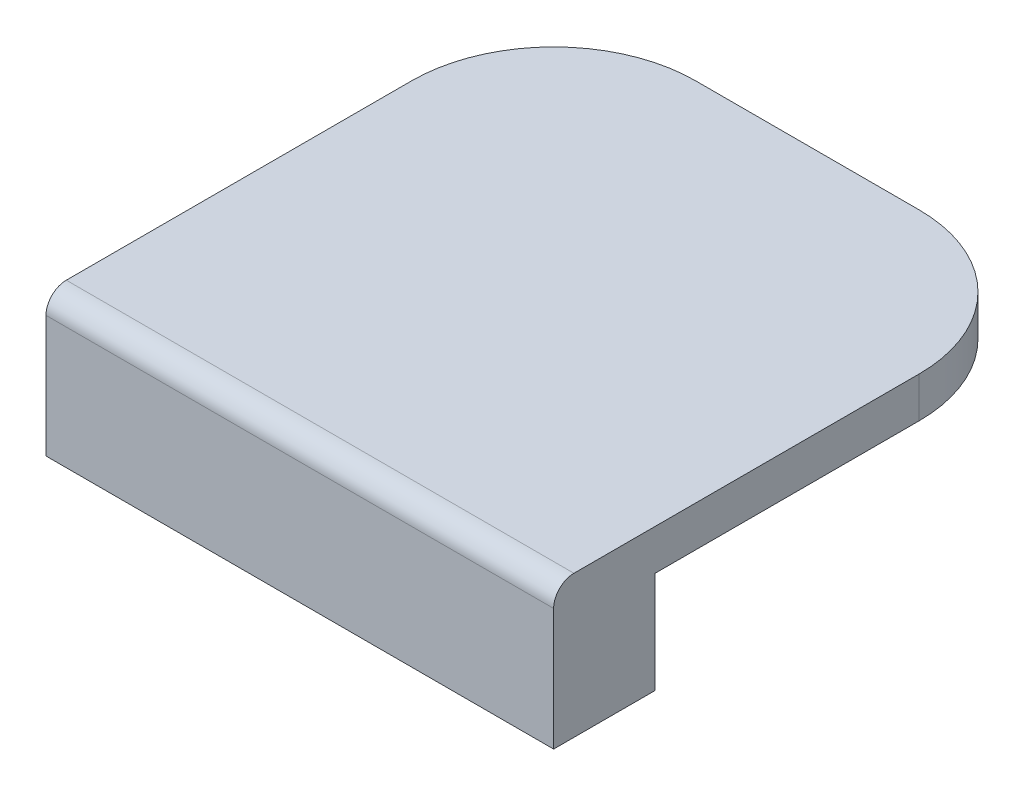
ISO-10303-21;
HEADER;
FILE_DESCRIPTION(('STEP AP214'),'2;1');
FILE_NAME('part.step','',(''),(''),'','','');
FILE_SCHEMA(('AUTOMOTIVE_DESIGN { 1 0 10303 214 1 1 1 1 }'));
ENDSEC;
DATA;
#1=APPLICATION_CONTEXT('core data for automotive mechanical design processes');
#2=APPLICATION_PROTOCOL_DEFINITION('international standard','automotive_design',2000,#1);
#3=PRODUCT_CONTEXT('',#1,'mechanical');
#4=PRODUCT('Part','Part','',(#3));
#5=PRODUCT_RELATED_PRODUCT_CATEGORY('part','',(#4));
#6=PRODUCT_DEFINITION_FORMATION('','',#4);
#7=PRODUCT_DEFINITION_CONTEXT('part definition',#1,'design');
#8=PRODUCT_DEFINITION('design','',#6,#7);
#9=PRODUCT_DEFINITION_SHAPE('','',#8);
#10=(LENGTH_UNIT() NAMED_UNIT(*) SI_UNIT(.MILLI.,.METRE.));
#11=(NAMED_UNIT(*) PLANE_ANGLE_UNIT() SI_UNIT($,.RADIAN.));
#12=(NAMED_UNIT(*) SI_UNIT($,.STERADIAN.) SOLID_ANGLE_UNIT());
#13=UNCERTAINTY_MEASURE_WITH_UNIT(LENGTH_MEASURE(1.E-05),#10,'distance_accuracy_value','');
#14=(GEOMETRIC_REPRESENTATION_CONTEXT(3) GLOBAL_UNCERTAINTY_ASSIGNED_CONTEXT((#13)) GLOBAL_UNIT_ASSIGNED_CONTEXT((#10,
#11,#12)) REPRESENTATION_CONTEXT('',''));
#15=CARTESIAN_POINT('',(0.,0.,0.));
#16=DIRECTION('',(0.,0.,1.));
#17=DIRECTION('',(1.,0.,0.));
#18=AXIS2_PLACEMENT_3D('',#15,#16,#17);
#19=CARTESIAN_POINT('',(-55.,0.,-55.));
#20=DIRECTION('',(0.,1.,0.));
#21=DIRECTION('',(0.,0.,1.));
#22=AXIS2_PLACEMENT_3D('',#19,#20,#21);
#23=PLANE('',#22);
#24=DIRECTION('',(1.,0.,0.));
#25=VECTOR('',#24,1.);
#26=CARTESIAN_POINT('',(-125.,0.,75.));
#27=LINE('',#26,#25);
#28=CARTESIAN_POINT('',(-125.,0.,74.9999999999999));
#29=VERTEX_POINT('',#28);
#30=CARTESIAN_POINT('',(125.,0.,75.));
#31=VERTEX_POINT('',#30);
#32=EDGE_CURVE('E123',#29,#31,#27,.T.);
#33=ORIENTED_EDGE('',*,*,#32,.F.);
#34=DIRECTION('',(0.,0.,1.));
#35=VECTOR('',#34,1.);
#36=CARTESIAN_POINT('',(-125.,0.,-55.));
#37=LINE('',#36,#35);
#38=CARTESIAN_POINT('',(-125.,0.,-55.));
#39=VERTEX_POINT('',#38);
#40=EDGE_CURVE('E129',#39,#29,#37,.T.);
#41=ORIENTED_EDGE('',*,*,#40,.F.);
#42=CARTESIAN_POINT('',(-55.,0.,-55.));
#43=DIRECTION('',(0.,1.,0.));
#44=DIRECTION('',(0.,0.,1.));
#45=AXIS2_PLACEMENT_3D('',#42,#43,#44);
#46=CIRCLE('',#45,70.);
#47=CARTESIAN_POINT('',(-55.,0.,-125.));
#48=VERTEX_POINT('',#47);
#49=EDGE_CURVE('E169',#48,#39,#46,.T.);
#50=ORIENTED_EDGE('',*,*,#49,.F.);
#51=DIRECTION('',(-1.,0.,0.));
#52=VECTOR('',#51,1.);
#53=CARTESIAN_POINT('',(-55.,0.,-125.));
#54=LINE('',#53,#52);
#55=CARTESIAN_POINT('',(55.,0.,-125.));
#56=VERTEX_POINT('',#55);
#57=EDGE_CURVE('E167',#56,#48,#54,.T.);
#58=ORIENTED_EDGE('',*,*,#57,.F.);
#59=CARTESIAN_POINT('',(55.,0.,-55.));
#60=DIRECTION('',(0.,1.,0.));
#61=DIRECTION('',(0.,0.,-1.));
#62=AXIS2_PLACEMENT_3D('',#59,#60,#61);
#63=CIRCLE('',#62,70.);
#64=CARTESIAN_POINT('',(125.,0.,-55.));
#65=VERTEX_POINT('',#64);
#66=EDGE_CURVE('E132',#65,#56,#63,.T.);
#67=ORIENTED_EDGE('',*,*,#66,.F.);
#68=DIRECTION('',(0.,0.,-1.));
#69=VECTOR('',#68,1.);
#70=CARTESIAN_POINT('',(125.,0.,-55.));
#71=LINE('',#70,#69);
#72=EDGE_CURVE('E130',#31,#65,#71,.T.);
#73=ORIENTED_EDGE('',*,*,#72,.F.);
#74=EDGE_LOOP('',(#33,#41,#50,#58,#67,#73));
#75=FACE_BOUND('',#74,.T.);
#76=ADVANCED_FACE('F34',(#75),#23,.F.);
#77=CARTESIAN_POINT('',(125.,20.,-55.));
#78=DIRECTION('',(-1.,0.,0.));
#79=DIRECTION('',(0.,0.,1.));
#80=AXIS2_PLACEMENT_3D('',#77,#78,#79);
#81=PLANE('',#80);
#82=DIRECTION('',(0.,0.,-1.));
#83=VECTOR('',#82,1.);
#84=CARTESIAN_POINT('',(125.,20.,-55.));
#85=LINE('',#84,#83);
#86=CARTESIAN_POINT('',(125.,20.,115.));
#87=VERTEX_POINT('',#86);
#88=CARTESIAN_POINT('',(125.,20.,-55.));
#89=VERTEX_POINT('',#88);
#90=EDGE_CURVE('E190',#87,#89,#85,.T.);
#91=ORIENTED_EDGE('',*,*,#90,.F.);
#92=CARTESIAN_POINT('',(125.,10.,115.));
#93=DIRECTION('',(-1.,0.,0.));
#94=DIRECTION('',(0.,0.,1.));
#95=AXIS2_PLACEMENT_3D('',#92,#93,#94);
#96=CIRCLE('',#95,10.);
#97=CARTESIAN_POINT('',(125.,10.,125.));
#98=VERTEX_POINT('',#97);
#99=EDGE_CURVE('E56',#87,#98,#96,.F.);
#100=ORIENTED_EDGE('',*,*,#99,.T.);
#101=DIRECTION('',(0.,-1.,0.));
#102=VECTOR('',#101,1.);
#103=CARTESIAN_POINT('',(125.,20.,125.));
#104=LINE('',#103,#102);
#105=CARTESIAN_POINT('',(125.,-50.,125.));
#106=VERTEX_POINT('',#105);
#107=EDGE_CURVE('E172',#98,#106,#104,.T.);
#108=ORIENTED_EDGE('',*,*,#107,.T.);
#109=DIRECTION('',(0.,0.,1.));
#110=VECTOR('',#109,1.);
#111=CARTESIAN_POINT('',(125.,-50.,125.));
#112=LINE('',#111,#110);
#113=CARTESIAN_POINT('',(125.,-50.,75.));
#114=VERTEX_POINT('',#113);
#115=EDGE_CURVE('E114',#114,#106,#112,.T.);
#116=ORIENTED_EDGE('',*,*,#115,.F.);
#117=DIRECTION('',(0.,1.,0.));
#118=VECTOR('',#117,1.);
#119=CARTESIAN_POINT('',(125.,-50.,75.));
#120=LINE('',#119,#118);
#121=EDGE_CURVE('E110',#114,#31,#120,.T.);
#122=ORIENTED_EDGE('',*,*,#121,.T.);
#123=ORIENTED_EDGE('',*,*,#72,.T.);
#124=DIRECTION('',(0.,-1.,0.));
#125=VECTOR('',#124,1.);
#126=CARTESIAN_POINT('',(125.,20.,-55.));
#127=LINE('',#126,#125);
#128=EDGE_CURVE('E143',#89,#65,#127,.T.);
#129=ORIENTED_EDGE('',*,*,#128,.F.);
#130=EDGE_LOOP('',(#91,#100,#108,#116,#122,#123,#129));
#131=FACE_BOUND('',#130,.T.);
#132=ADVANCED_FACE('F205',(#131),#81,.F.);
#133=CARTESIAN_POINT('',(55.,20.,-55.));
#134=DIRECTION('',(0.,-1.,0.));
#135=DIRECTION('',(0.,0.,-1.));
#136=AXIS2_PLACEMENT_3D('',#133,#134,#135);
#137=CYLINDRICAL_SURFACE('',#136,70.);
#138=ORIENTED_EDGE('',*,*,#66,.T.);
#139=DIRECTION('',(0.,-1.,0.));
#140=VECTOR('',#139,1.);
#141=CARTESIAN_POINT('',(55.,20.,-125.));
#142=LINE('',#141,#140);
#143=CARTESIAN_POINT('',(55.,20.,-125.));
#144=VERTEX_POINT('',#143);
#145=EDGE_CURVE('E148',#144,#56,#142,.T.);
#146=ORIENTED_EDGE('',*,*,#145,.F.);
#147=CARTESIAN_POINT('',(55.,20.,-55.));
#148=DIRECTION('',(0.,1.,0.));
#149=DIRECTION('',(0.,0.,-1.));
#150=AXIS2_PLACEMENT_3D('',#147,#148,#149);
#151=CIRCLE('',#150,70.);
#152=EDGE_CURVE('E191',#89,#144,#151,.T.);
#153=ORIENTED_EDGE('',*,*,#152,.F.);
#154=ORIENTED_EDGE('',*,*,#128,.T.);
#155=EDGE_LOOP('',(#138,#146,#153,#154));
#156=FACE_BOUND('',#155,.T.);
#157=ADVANCED_FACE('F207',(#156),#137,.T.);
#158=CARTESIAN_POINT('',(-55.,20.,-125.));
#159=DIRECTION('',(0.,0.,1.));
#160=DIRECTION('',(1.,0.,0.));
#161=AXIS2_PLACEMENT_3D('',#158,#159,#160);
#162=PLANE('',#161);
#163=ORIENTED_EDGE('',*,*,#57,.T.);
#164=DIRECTION('',(0.,-1.,0.));
#165=VECTOR('',#164,1.);
#166=CARTESIAN_POINT('',(-55.,20.,-125.));
#167=LINE('',#166,#165);
#168=CARTESIAN_POINT('',(-55.,20.,-125.));
#169=VERTEX_POINT('',#168);
#170=EDGE_CURVE('E154',#169,#48,#167,.T.);
#171=ORIENTED_EDGE('',*,*,#170,.F.);
#172=DIRECTION('',(-1.,0.,0.));
#173=VECTOR('',#172,1.);
#174=CARTESIAN_POINT('',(-55.,20.,-125.));
#175=LINE('',#174,#173);
#176=EDGE_CURVE('E193',#144,#169,#175,.T.);
#177=ORIENTED_EDGE('',*,*,#176,.F.);
#178=ORIENTED_EDGE('',*,*,#145,.T.);
#179=EDGE_LOOP('',(#163,#171,#177,#178));
#180=FACE_BOUND('',#179,.T.);
#181=ADVANCED_FACE('F208',(#180),#162,.F.);
#182=CARTESIAN_POINT('',(-55.,20.,-55.));
#183=DIRECTION('',(0.,-1.,0.));
#184=DIRECTION('',(0.,0.,-1.));
#185=AXIS2_PLACEMENT_3D('',#182,#183,#184);
#186=CYLINDRICAL_SURFACE('',#185,70.);
#187=ORIENTED_EDGE('',*,*,#49,.T.);
#188=DIRECTION('',(0.,-1.,0.));
#189=VECTOR('',#188,1.);
#190=CARTESIAN_POINT('',(-125.,20.,-55.));
#191=LINE('',#190,#189);
#192=CARTESIAN_POINT('',(-125.,20.,-55.));
#193=VERTEX_POINT('',#192);
#194=EDGE_CURVE('E176',#193,#39,#191,.T.);
#195=ORIENTED_EDGE('',*,*,#194,.F.);
#196=CARTESIAN_POINT('',(-55.,20.,-55.));
#197=DIRECTION('',(0.,1.,0.));
#198=DIRECTION('',(0.,0.,1.));
#199=AXIS2_PLACEMENT_3D('',#196,#197,#198);
#200=CIRCLE('',#199,70.);
#201=EDGE_CURVE('E184',#169,#193,#200,.T.);
#202=ORIENTED_EDGE('',*,*,#201,.F.);
#203=ORIENTED_EDGE('',*,*,#170,.T.);
#204=EDGE_LOOP('',(#187,#195,#202,#203));
#205=FACE_BOUND('',#204,.T.);
#206=ADVANCED_FACE('F182',(#205),#186,.T.);
#207=CARTESIAN_POINT('',(-125.,20.,-55.));
#208=DIRECTION('',(1.,0.,0.));
#209=DIRECTION('',(0.,0.,-1.));
#210=AXIS2_PLACEMENT_3D('',#207,#208,#209);
#211=PLANE('',#210);
#212=DIRECTION('',(0.,-1.,0.));
#213=VECTOR('',#212,1.);
#214=CARTESIAN_POINT('',(-125.,20.,125.));
#215=LINE('',#214,#213);
#216=CARTESIAN_POINT('',(-125.,10.,125.));
#217=VERTEX_POINT('',#216);
#218=CARTESIAN_POINT('',(-125.,-50.,125.));
#219=VERTEX_POINT('',#218);
#220=EDGE_CURVE('E174',#217,#219,#215,.T.);
#221=ORIENTED_EDGE('',*,*,#220,.F.);
#222=CARTESIAN_POINT('',(-125.,10.,115.));
#223=DIRECTION('',(1.,0.,0.));
#224=DIRECTION('',(0.,0.,-1.));
#225=AXIS2_PLACEMENT_3D('',#222,#223,#224);
#226=CIRCLE('',#225,10.);
#227=CARTESIAN_POINT('',(-125.,20.,115.));
#228=VERTEX_POINT('',#227);
#229=EDGE_CURVE('E11',#217,#228,#226,.F.);
#230=ORIENTED_EDGE('',*,*,#229,.T.);
#231=DIRECTION('',(0.,0.,1.));
#232=VECTOR('',#231,1.);
#233=CARTESIAN_POINT('',(-125.,20.,-55.));
#234=LINE('',#233,#232);
#235=EDGE_CURVE('E164',#193,#228,#234,.T.);
#236=ORIENTED_EDGE('',*,*,#235,.F.);
#237=ORIENTED_EDGE('',*,*,#194,.T.);
#238=ORIENTED_EDGE('',*,*,#40,.T.);
#239=DIRECTION('',(0.,1.,0.));
#240=VECTOR('',#239,1.);
#241=CARTESIAN_POINT('',(-125.,-50.,75.));
#242=LINE('',#241,#240);
#243=CARTESIAN_POINT('',(-125.,-50.,75.));
#244=VERTEX_POINT('',#243);
#245=EDGE_CURVE('E108',#244,#29,#242,.T.);
#246=ORIENTED_EDGE('',*,*,#245,.F.);
#247=DIRECTION('',(0.,0.,-1.));
#248=VECTOR('',#247,1.);
#249=CARTESIAN_POINT('',(-125.,-50.,125.));
#250=LINE('',#249,#248);
#251=EDGE_CURVE('E115',#219,#244,#250,.T.);
#252=ORIENTED_EDGE('',*,*,#251,.F.);
#253=EDGE_LOOP('',(#221,#230,#236,#237,#238,#246,#252));
#254=FACE_BOUND('',#253,.T.);
#255=ADVANCED_FACE('F126',(#254),#211,.F.);
#256=CARTESIAN_POINT('',(-125.,20.,125.));
#257=DIRECTION('',(0.,0.,-1.));
#258=DIRECTION('',(-1.,0.,0.));
#259=AXIS2_PLACEMENT_3D('',#256,#257,#258);
#260=PLANE('',#259);
#261=ORIENTED_EDGE('',*,*,#107,.F.);
#262=DIRECTION('',(1.,0.,0.));
#263=VECTOR('',#262,1.);
#264=CARTESIAN_POINT('',(-125.,10.,125.));
#265=LINE('',#264,#263);
#266=EDGE_CURVE('E42',#98,#217,#265,.F.);
#267=ORIENTED_EDGE('',*,*,#266,.T.);
#268=ORIENTED_EDGE('',*,*,#220,.T.);
#269=DIRECTION('',(-1.,0.,0.));
#270=VECTOR('',#269,1.);
#271=CARTESIAN_POINT('',(-125.,-50.,125.));
#272=LINE('',#271,#270);
#273=EDGE_CURVE('E121',#106,#219,#272,.T.);
#274=ORIENTED_EDGE('',*,*,#273,.F.);
#275=EDGE_LOOP('',(#261,#267,#268,#274));
#276=FACE_BOUND('',#275,.T.);
#277=ADVANCED_FACE('F203',(#276),#260,.F.);
#278=CARTESIAN_POINT('',(-55.,20.,-55.));
#279=DIRECTION('',(0.,1.,0.));
#280=DIRECTION('',(0.,0.,1.));
#281=AXIS2_PLACEMENT_3D('',#278,#279,#280);
#282=PLANE('',#281);
#283=ORIENTED_EDGE('',*,*,#235,.T.);
#284=DIRECTION('',(1.,0.,0.));
#285=VECTOR('',#284,1.);
#286=CARTESIAN_POINT('',(125.,20.,115.));
#287=LINE('',#286,#285);
#288=EDGE_CURVE('E140',#228,#87,#287,.T.);
#289=ORIENTED_EDGE('',*,*,#288,.T.);
#290=ORIENTED_EDGE('',*,*,#90,.T.);
#291=ORIENTED_EDGE('',*,*,#152,.T.);
#292=ORIENTED_EDGE('',*,*,#176,.T.);
#293=ORIENTED_EDGE('',*,*,#201,.T.);
#294=EDGE_LOOP('',(#283,#289,#290,#291,#292,#293));
#295=FACE_BOUND('',#294,.T.);
#296=ADVANCED_FACE('F200',(#295),#282,.T.);
#297=CARTESIAN_POINT('',(-125.,-50.,75.));
#298=DIRECTION('',(0.,0.,1.));
#299=DIRECTION('',(1.,0.,0.));
#300=AXIS2_PLACEMENT_3D('',#297,#298,#299);
#301=PLANE('',#300);
#302=ORIENTED_EDGE('',*,*,#32,.T.);
#303=ORIENTED_EDGE('',*,*,#121,.F.);
#304=DIRECTION('',(1.,0.,0.));
#305=VECTOR('',#304,1.);
#306=CARTESIAN_POINT('',(-125.,-50.,75.));
#307=LINE('',#306,#305);
#308=EDGE_CURVE('E103',#244,#114,#307,.T.);
#309=ORIENTED_EDGE('',*,*,#308,.F.);
#310=ORIENTED_EDGE('',*,*,#245,.T.);
#311=EDGE_LOOP('',(#302,#303,#309,#310));
#312=FACE_BOUND('',#311,.T.);
#313=ADVANCED_FACE('F106',(#312),#301,.F.);
#314=CARTESIAN_POINT('',(0.,-50.,0.));
#315=DIRECTION('',(0.,-1.,0.));
#316=DIRECTION('',(0.,0.,-1.));
#317=AXIS2_PLACEMENT_3D('',#314,#315,#316);
#318=PLANE('',#317);
#319=ORIENTED_EDGE('',*,*,#251,.T.);
#320=ORIENTED_EDGE('',*,*,#308,.T.);
#321=ORIENTED_EDGE('',*,*,#115,.T.);
#322=ORIENTED_EDGE('',*,*,#273,.T.);
#323=EDGE_LOOP('',(#319,#320,#321,#322));
#324=FACE_BOUND('',#323,.T.);
#325=ADVANCED_FACE('F119',(#324),#318,.T.);
#326=CARTESIAN_POINT('',(-55.,10.,115.));
#327=DIRECTION('',(-1.,0.,0.));
#328=DIRECTION('',(0.,0.,1.));
#329=AXIS2_PLACEMENT_3D('',#326,#327,#328);
#330=CYLINDRICAL_SURFACE('',#329,10.);
#331=ORIENTED_EDGE('',*,*,#229,.F.);
#332=ORIENTED_EDGE('',*,*,#266,.F.);
#333=ORIENTED_EDGE('',*,*,#99,.F.);
#334=ORIENTED_EDGE('',*,*,#288,.F.);
#335=EDGE_LOOP('',(#331,#332,#333,#334));
#336=FACE_BOUND('',#335,.T.);
#337=ADVANCED_FACE('F36',(#336),#330,.T.);
#338=CLOSED_SHELL('',(#76,#132,#157,#181,#206,#255,#277,#296,#313,#325,#337));
#339=MANIFOLD_SOLID_BREP('B2',#338);
#340=ADVANCED_BREP_SHAPE_REPRESENTATION('',(#18,#339),#14);
#341=SHAPE_DEFINITION_REPRESENTATION(#9,#340);
ENDSEC;
END-ISO-10303-21;
